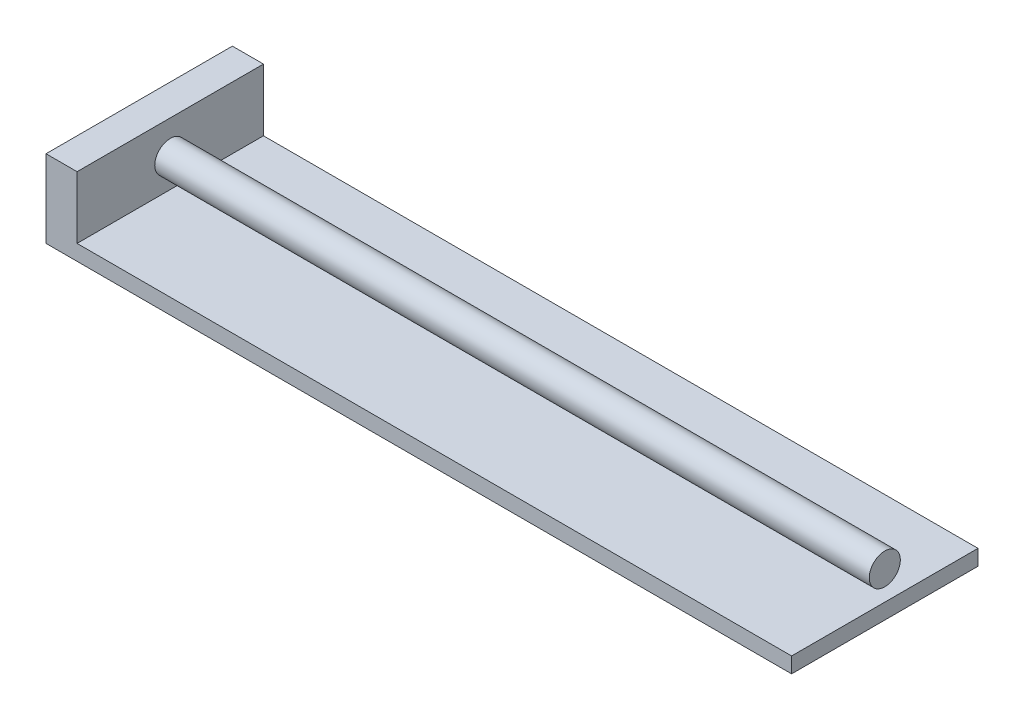
ISO-10303-21;
HEADER;
FILE_DESCRIPTION(('STEP AP214'),'2;1');
FILE_NAME('part.step','',(''),(''),'','','');
FILE_SCHEMA(('AUTOMOTIVE_DESIGN { 1 0 10303 214 1 1 1 1 }'));
ENDSEC;
DATA;
#1=APPLICATION_CONTEXT('core data for automotive mechanical design processes');
#2=APPLICATION_PROTOCOL_DEFINITION('international standard','automotive_design',2000,#1);
#3=PRODUCT_CONTEXT('',#1,'mechanical');
#4=PRODUCT('Part','Part','',(#3));
#5=PRODUCT_RELATED_PRODUCT_CATEGORY('part','',(#4));
#6=PRODUCT_DEFINITION_FORMATION('','',#4);
#7=PRODUCT_DEFINITION_CONTEXT('part definition',#1,'design');
#8=PRODUCT_DEFINITION('design','',#6,#7);
#9=PRODUCT_DEFINITION_SHAPE('','',#8);
#10=(LENGTH_UNIT() NAMED_UNIT(*) SI_UNIT(.MILLI.,.METRE.));
#11=(NAMED_UNIT(*) PLANE_ANGLE_UNIT() SI_UNIT($,.RADIAN.));
#12=(NAMED_UNIT(*) SI_UNIT($,.STERADIAN.) SOLID_ANGLE_UNIT());
#13=UNCERTAINTY_MEASURE_WITH_UNIT(LENGTH_MEASURE(1.E-05),#10,'distance_accuracy_value','');
#14=(GEOMETRIC_REPRESENTATION_CONTEXT(3) GLOBAL_UNCERTAINTY_ASSIGNED_CONTEXT((#13)) GLOBAL_UNIT_ASSIGNED_CONTEXT((#10,
#11,#12)) REPRESENTATION_CONTEXT('',''));
#15=CARTESIAN_POINT('',(0.,0.,0.));
#16=DIRECTION('',(0.,0.,1.));
#17=DIRECTION('',(1.,0.,0.));
#18=AXIS2_PLACEMENT_3D('',#15,#16,#17);
#19=CARTESIAN_POINT('',(0.,5.,0.));
#20=DIRECTION('',(0.,-1.,0.));
#21=DIRECTION('',(0.,0.,-1.));
#22=AXIS2_PLACEMENT_3D('',#19,#20,#21);
#23=PLANE('',#22);
#24=DIRECTION('',(0.,0.,-1.));
#25=VECTOR('',#24,1.);
#26=CARTESIAN_POINT('',(-110.,5.,-30.));
#27=LINE('',#26,#25);
#28=CARTESIAN_POINT('',(-110.,5.,30.));
#29=VERTEX_POINT('',#28);
#30=CARTESIAN_POINT('',(-110.,5.,-30.));
#31=VERTEX_POINT('',#30);
#32=EDGE_CURVE('E53',#29,#31,#27,.T.);
#33=ORIENTED_EDGE('',*,*,#32,.F.);
#34=DIRECTION('',(1.,0.,0.));
#35=VECTOR('',#34,1.);
#36=CARTESIAN_POINT('',(-120.,5.,30.));
#37=LINE('',#36,#35);
#38=CARTESIAN_POINT('',(120.,5.,30.));
#39=VERTEX_POINT('',#38);
#40=EDGE_CURVE('E56',#29,#39,#37,.T.);
#41=ORIENTED_EDGE('',*,*,#40,.T.);
#42=DIRECTION('',(0.,0.,-1.));
#43=VECTOR('',#42,1.);
#44=CARTESIAN_POINT('',(120.,5.,30.));
#45=LINE('',#44,#43);
#46=CARTESIAN_POINT('',(120.,5.,-30.));
#47=VERTEX_POINT('',#46);
#48=EDGE_CURVE('E89',#39,#47,#45,.T.);
#49=ORIENTED_EDGE('',*,*,#48,.T.);
#50=DIRECTION('',(-1.,0.,0.));
#51=VECTOR('',#50,1.);
#52=CARTESIAN_POINT('',(-120.,5.,-30.));
#53=LINE('',#52,#51);
#54=EDGE_CURVE('E119',#47,#31,#53,.T.);
#55=ORIENTED_EDGE('',*,*,#54,.T.);
#56=EDGE_LOOP('',(#33,#41,#49,#55));
#57=FACE_BOUND('',#56,.T.);
#58=ADVANCED_FACE('F39',(#57),#23,.F.);
#59=CARTESIAN_POINT('',(120.,5.,30.));
#60=DIRECTION('',(-1.,0.,0.));
#61=DIRECTION('',(0.,0.,1.));
#62=AXIS2_PLACEMENT_3D('',#59,#60,#61);
#63=PLANE('',#62);
#64=DIRECTION('',(0.,0.,-1.));
#65=VECTOR('',#64,1.);
#66=CARTESIAN_POINT('',(120.,0.,30.));
#67=LINE('',#66,#65);
#68=CARTESIAN_POINT('',(120.,0.,30.));
#69=VERTEX_POINT('',#68);
#70=CARTESIAN_POINT('',(120.,0.,-30.));
#71=VERTEX_POINT('',#70);
#72=EDGE_CURVE('E96',#69,#71,#67,.T.);
#73=ORIENTED_EDGE('',*,*,#72,.T.);
#74=DIRECTION('',(0.,-1.,0.));
#75=VECTOR('',#74,1.);
#76=CARTESIAN_POINT('',(120.,5.,-30.));
#77=LINE('',#76,#75);
#78=EDGE_CURVE('E50',#47,#71,#77,.T.);
#79=ORIENTED_EDGE('',*,*,#78,.F.);
#80=ORIENTED_EDGE('',*,*,#48,.F.);
#81=DIRECTION('',(0.,-1.,0.));
#82=VECTOR('',#81,1.);
#83=CARTESIAN_POINT('',(120.,5.,30.));
#84=LINE('',#83,#82);
#85=EDGE_CURVE('E85',#39,#69,#84,.T.);
#86=ORIENTED_EDGE('',*,*,#85,.T.);
#87=EDGE_LOOP('',(#73,#79,#80,#86));
#88=FACE_BOUND('',#87,.T.);
#89=ADVANCED_FACE('F41',(#88),#63,.F.);
#90=CARTESIAN_POINT('',(-120.,5.,-30.));
#91=DIRECTION('',(0.,0.,1.));
#92=DIRECTION('',(1.,0.,0.));
#93=AXIS2_PLACEMENT_3D('',#90,#91,#92);
#94=PLANE('',#93);
#95=DIRECTION('',(-1.,0.,0.));
#96=VECTOR('',#95,1.);
#97=CARTESIAN_POINT('',(-120.,0.,-30.));
#98=LINE('',#97,#96);
#99=CARTESIAN_POINT('',(-120.,0.,-30.));
#100=VERTEX_POINT('',#99);
#101=EDGE_CURVE('E97',#71,#100,#98,.T.);
#102=ORIENTED_EDGE('',*,*,#101,.T.);
#103=DIRECTION('',(0.,-1.,0.));
#104=VECTOR('',#103,1.);
#105=CARTESIAN_POINT('',(-120.,5.,-30.));
#106=LINE('',#105,#104);
#107=CARTESIAN_POINT('',(-120.,25.,-30.));
#108=VERTEX_POINT('',#107);
#109=EDGE_CURVE('E115',#108,#100,#106,.T.);
#110=ORIENTED_EDGE('',*,*,#109,.F.);
#111=DIRECTION('',(-1.,0.,0.));
#112=VECTOR('',#111,1.);
#113=CARTESIAN_POINT('',(-120.,25.,-30.));
#114=LINE('',#113,#112);
#115=CARTESIAN_POINT('',(-110.,25.,-30.));
#116=VERTEX_POINT('',#115);
#117=EDGE_CURVE('E123',#116,#108,#114,.T.);
#118=ORIENTED_EDGE('',*,*,#117,.F.);
#119=DIRECTION('',(0.,-1.,0.));
#120=VECTOR('',#119,1.);
#121=CARTESIAN_POINT('',(-110.,25.,-30.));
#122=LINE('',#121,#120);
#123=EDGE_CURVE('E104',#116,#31,#122,.T.);
#124=ORIENTED_EDGE('',*,*,#123,.T.);
#125=ORIENTED_EDGE('',*,*,#54,.F.);
#126=ORIENTED_EDGE('',*,*,#78,.T.);
#127=EDGE_LOOP('',(#102,#110,#118,#124,#125,#126));
#128=FACE_BOUND('',#127,.T.);
#129=ADVANCED_FACE('F113',(#128),#94,.F.);
#130=CARTESIAN_POINT('',(-120.,5.,30.));
#131=DIRECTION('',(1.,0.,0.));
#132=DIRECTION('',(0.,0.,-1.));
#133=AXIS2_PLACEMENT_3D('',#130,#131,#132);
#134=PLANE('',#133);
#135=DIRECTION('',(0.,0.,1.));
#136=VECTOR('',#135,1.);
#137=CARTESIAN_POINT('',(-120.,0.,30.));
#138=LINE('',#137,#136);
#139=CARTESIAN_POINT('',(-120.,0.,30.));
#140=VERTEX_POINT('',#139);
#141=EDGE_CURVE('E93',#100,#140,#138,.T.);
#142=ORIENTED_EDGE('',*,*,#141,.T.);
#143=DIRECTION('',(0.,-1.,0.));
#144=VECTOR('',#143,1.);
#145=CARTESIAN_POINT('',(-120.,5.,30.));
#146=LINE('',#145,#144);
#147=CARTESIAN_POINT('',(-120.,25.,30.));
#148=VERTEX_POINT('',#147);
#149=EDGE_CURVE('E88',#148,#140,#146,.T.);
#150=ORIENTED_EDGE('',*,*,#149,.F.);
#151=DIRECTION('',(0.,0.,1.));
#152=VECTOR('',#151,1.);
#153=CARTESIAN_POINT('',(-120.,25.,-30.));
#154=LINE('',#153,#152);
#155=EDGE_CURVE('E130',#108,#148,#154,.T.);
#156=ORIENTED_EDGE('',*,*,#155,.F.);
#157=ORIENTED_EDGE('',*,*,#109,.T.);
#158=EDGE_LOOP('',(#142,#150,#156,#157));
#159=FACE_BOUND('',#158,.T.);
#160=ADVANCED_FACE('F170',(#159),#134,.F.);
#161=CARTESIAN_POINT('',(-120.,5.,30.));
#162=DIRECTION('',(0.,0.,-1.));
#163=DIRECTION('',(-1.,0.,0.));
#164=AXIS2_PLACEMENT_3D('',#161,#162,#163);
#165=PLANE('',#164);
#166=DIRECTION('',(1.,0.,0.));
#167=VECTOR('',#166,1.);
#168=CARTESIAN_POINT('',(-120.,0.,30.));
#169=LINE('',#168,#167);
#170=EDGE_CURVE('E76',#140,#69,#169,.T.);
#171=ORIENTED_EDGE('',*,*,#170,.T.);
#172=ORIENTED_EDGE('',*,*,#85,.F.);
#173=ORIENTED_EDGE('',*,*,#40,.F.);
#174=DIRECTION('',(0.,-1.,0.));
#175=VECTOR('',#174,1.);
#176=CARTESIAN_POINT('',(-110.,25.,30.));
#177=LINE('',#176,#175);
#178=CARTESIAN_POINT('',(-110.,25.,30.));
#179=VERTEX_POINT('',#178);
#180=EDGE_CURVE('E101',#179,#29,#177,.T.);
#181=ORIENTED_EDGE('',*,*,#180,.F.);
#182=DIRECTION('',(1.,0.,0.));
#183=VECTOR('',#182,1.);
#184=CARTESIAN_POINT('',(-120.,25.,30.));
#185=LINE('',#184,#183);
#186=EDGE_CURVE('E131',#148,#179,#185,.T.);
#187=ORIENTED_EDGE('',*,*,#186,.F.);
#188=ORIENTED_EDGE('',*,*,#149,.T.);
#189=EDGE_LOOP('',(#171,#172,#173,#181,#187,#188));
#190=FACE_BOUND('',#189,.T.);
#191=ADVANCED_FACE('F82',(#190),#165,.F.);
#192=CARTESIAN_POINT('',(0.,0.,0.));
#193=DIRECTION('',(0.,-1.,0.));
#194=DIRECTION('',(0.,0.,-1.));
#195=AXIS2_PLACEMENT_3D('',#192,#193,#194);
#196=PLANE('',#195);
#197=ORIENTED_EDGE('',*,*,#72,.F.);
#198=ORIENTED_EDGE('',*,*,#170,.F.);
#199=ORIENTED_EDGE('',*,*,#141,.F.);
#200=ORIENTED_EDGE('',*,*,#101,.F.);
#201=EDGE_LOOP('',(#197,#198,#199,#200));
#202=FACE_BOUND('',#201,.T.);
#203=ADVANCED_FACE('F98',(#202),#196,.T.);
#204=CARTESIAN_POINT('',(-110.,25.,-30.));
#205=DIRECTION('',(-1.,0.,0.));
#206=DIRECTION('',(0.,0.,1.));
#207=AXIS2_PLACEMENT_3D('',#204,#205,#206);
#208=PLANE('',#207);
#209=CARTESIAN_POINT('',(-110.,14.27,0.));
#210=DIRECTION('',(-1.,0.,0.));
#211=DIRECTION('',(0.,0.,1.));
#212=AXIS2_PLACEMENT_3D('',#209,#210,#211);
#213=CIRCLE('',#212,5.);
#214=CARTESIAN_POINT('',(-110.,14.27,5.00000000000003));
#215=VERTEX_POINT('',#214);
#216=EDGE_CURVE('E11',#215,#215,#213,.F.);
#217=ORIENTED_EDGE('',*,*,#216,.F.);
#218=EDGE_LOOP('',(#217));
#219=FACE_BOUND('',#218,.T.);
#220=ORIENTED_EDGE('',*,*,#32,.T.);
#221=ORIENTED_EDGE('',*,*,#123,.F.);
#222=DIRECTION('',(0.,0.,-1.));
#223=VECTOR('',#222,1.);
#224=CARTESIAN_POINT('',(-110.,25.,-30.));
#225=LINE('',#224,#223);
#226=EDGE_CURVE('E132',#179,#116,#225,.T.);
#227=ORIENTED_EDGE('',*,*,#226,.F.);
#228=ORIENTED_EDGE('',*,*,#180,.T.);
#229=EDGE_LOOP('',(#220,#221,#227,#228));
#230=FACE_BOUND('',#229,.T.);
#231=ADVANCED_FACE('F151',(#219,#230),#208,.F.);
#232=CARTESIAN_POINT('',(0.,25.,0.));
#233=DIRECTION('',(0.,1.,0.));
#234=DIRECTION('',(0.,0.,1.));
#235=AXIS2_PLACEMENT_3D('',#232,#233,#234);
#236=PLANE('',#235);
#237=ORIENTED_EDGE('',*,*,#155,.T.);
#238=ORIENTED_EDGE('',*,*,#186,.T.);
#239=ORIENTED_EDGE('',*,*,#226,.T.);
#240=ORIENTED_EDGE('',*,*,#117,.T.);
#241=EDGE_LOOP('',(#237,#238,#239,#240));
#242=FACE_BOUND('',#241,.T.);
#243=ADVANCED_FACE('F150',(#242),#236,.T.);
#244=CARTESIAN_POINT('',(120.,14.27,0.));
#245=DIRECTION('',(-1.,0.,0.));
#246=DIRECTION('',(0.,0.,1.));
#247=AXIS2_PLACEMENT_3D('',#244,#245,#246);
#248=CYLINDRICAL_SURFACE('',#247,5.);
#249=CARTESIAN_POINT('',(120.,14.27,0.));
#250=DIRECTION('',(1.,0.,0.));
#251=DIRECTION('',(0.,0.,-1.));
#252=AXIS2_PLACEMENT_3D('',#249,#250,#251);
#253=CIRCLE('',#252,5.);
#254=CARTESIAN_POINT('',(120.,14.27,-5.00000000000003));
#255=VERTEX_POINT('',#254);
#256=EDGE_CURVE('E126',#255,#255,#253,.T.);
#257=ORIENTED_EDGE('',*,*,#256,.F.);
#258=EDGE_LOOP('',(#257));
#259=FACE_BOUND('',#258,.T.);
#260=ORIENTED_EDGE('',*,*,#216,.T.);
#261=EDGE_LOOP('',(#260));
#262=FACE_BOUND('',#261,.T.);
#263=ADVANCED_FACE('F145',(#259,#262),#248,.T.);
#264=CARTESIAN_POINT('',(120.,14.27,0.));
#265=DIRECTION('',(1.,0.,0.));
#266=DIRECTION('',(0.,0.,-1.));
#267=AXIS2_PLACEMENT_3D('',#264,#265,#266);
#268=PLANE('',#267);
#269=ORIENTED_EDGE('',*,*,#256,.T.);
#270=EDGE_LOOP('',(#269));
#271=FACE_BOUND('',#270,.T.);
#272=ADVANCED_FACE('F142',(#271),#268,.T.);
#273=CLOSED_SHELL('',(#58,#89,#129,#160,#191,#203,#231,#243,#263,#272));
#274=MANIFOLD_SOLID_BREP('B2',#273);
#275=ADVANCED_BREP_SHAPE_REPRESENTATION('',(#18,#274),#14);
#276=SHAPE_DEFINITION_REPRESENTATION(#9,#275);
ENDSEC;
END-ISO-10303-21;
